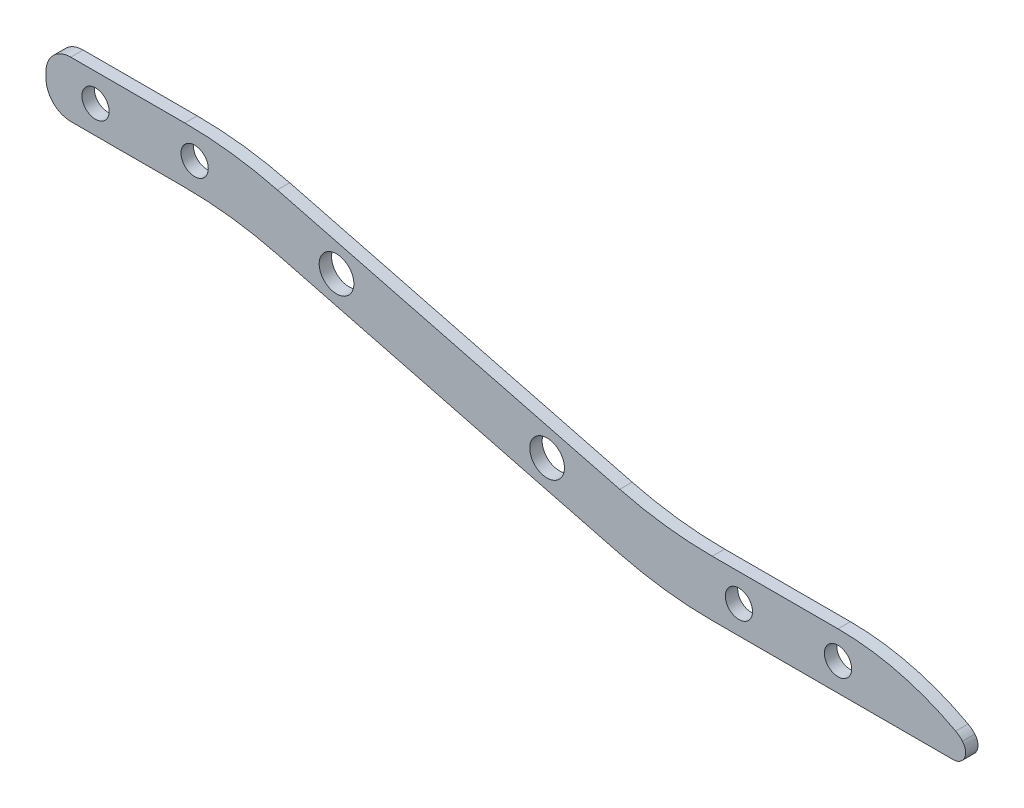
ISO-10303-21;
HEADER;
FILE_DESCRIPTION(('STEP AP214'),'2;1');
FILE_NAME('part.step','',(''),(''),'','','');
FILE_SCHEMA(('AUTOMOTIVE_DESIGN { 1 0 10303 214 1 1 1 1 }'));
ENDSEC;
DATA;
#1=APPLICATION_CONTEXT('core data for automotive mechanical design processes');
#2=APPLICATION_PROTOCOL_DEFINITION('international standard','automotive_design',2000,#1);
#3=PRODUCT_CONTEXT('',#1,'mechanical');
#4=PRODUCT('Part','Part','',(#3));
#5=PRODUCT_RELATED_PRODUCT_CATEGORY('part','',(#4));
#6=PRODUCT_DEFINITION_FORMATION('','',#4);
#7=PRODUCT_DEFINITION_CONTEXT('part definition',#1,'design');
#8=PRODUCT_DEFINITION('design','',#6,#7);
#9=PRODUCT_DEFINITION_SHAPE('','',#8);
#10=(LENGTH_UNIT() NAMED_UNIT(*) SI_UNIT(.MILLI.,.METRE.));
#11=(NAMED_UNIT(*) PLANE_ANGLE_UNIT() SI_UNIT($,.RADIAN.));
#12=(NAMED_UNIT(*) SI_UNIT($,.STERADIAN.) SOLID_ANGLE_UNIT());
#13=UNCERTAINTY_MEASURE_WITH_UNIT(LENGTH_MEASURE(1.E-05),#10,'distance_accuracy_value','');
#14=(GEOMETRIC_REPRESENTATION_CONTEXT(3) GLOBAL_UNCERTAINTY_ASSIGNED_CONTEXT((#13)) GLOBAL_UNIT_ASSIGNED_CONTEXT((#10,
#11,#12)) REPRESENTATION_CONTEXT('',''));
#15=CARTESIAN_POINT('',(0.,0.,0.));
#16=DIRECTION('',(0.,0.,1.));
#17=DIRECTION('',(1.,0.,0.));
#18=AXIS2_PLACEMENT_3D('',#15,#16,#17);
#19=CARTESIAN_POINT('',(16.6716723939733,27.75,1.));
#20=DIRECTION('',(0.,0.,1.));
#21=DIRECTION('',(1.,0.,0.));
#22=AXIS2_PLACEMENT_3D('',#19,#20,#21);
#23=PLANE('',#22);
#24=CARTESIAN_POINT('',(-13.6677647995653,2.32420737373456,1.));
#25=DIRECTION('',(0.,0.,1.));
#26=DIRECTION('',(1.,0.,0.));
#27=AXIS2_PLACEMENT_3D('',#24,#25,#26);
#28=CIRCLE('',#27,1.4);
#29=CARTESIAN_POINT('',(-12.2677647995653,2.32420737373456,1.));
#30=VERTEX_POINT('',#29);
#31=EDGE_CURVE('E355',#30,#30,#28,.T.);
#32=ORIENTED_EDGE('',*,*,#31,.F.);
#33=EDGE_LOOP('',(#32));
#34=FACE_BOUND('',#33,.T.);
#35=CARTESIAN_POINT('',(3.33223520043473,-2.04998442264176,1.));
#36=DIRECTION('',(0.,0.,1.));
#37=DIRECTION('',(1.,0.,0.));
#38=AXIS2_PLACEMENT_3D('',#35,#36,#37);
#39=CIRCLE('',#38,1.4);
#40=CARTESIAN_POINT('',(4.73223520043473,-2.04998442264176,1.));
#41=VERTEX_POINT('',#40);
#42=EDGE_CURVE('E361',#41,#41,#39,.T.);
#43=ORIENTED_EDGE('',*,*,#42,.F.);
#44=EDGE_LOOP('',(#43));
#45=FACE_BOUND('',#44,.T.);
#46=CARTESIAN_POINT('',(-25.1237342699777,4.5,1.));
#47=DIRECTION('',(0.,0.,1.));
#48=DIRECTION('',(1.,0.,0.));
#49=AXIS2_PLACEMENT_3D('',#46,#47,#48);
#50=CIRCLE('',#49,1.10000000000001);
#51=CARTESIAN_POINT('',(-24.0237342699777,4.5,1.));
#52=VERTEX_POINT('',#51);
#53=EDGE_CURVE('E372',#52,#52,#50,.T.);
#54=ORIENTED_EDGE('',*,*,#53,.F.);
#55=EDGE_LOOP('',(#54));
#56=FACE_BOUND('',#55,.T.);
#57=CARTESIAN_POINT('',(26.8214711577052,-4.5,1.));
#58=DIRECTION('',(0.,0.,1.));
#59=DIRECTION('',(1.,0.,0.));
#60=AXIS2_PLACEMENT_3D('',#57,#58,#59);
#61=CIRCLE('',#60,1.09999999999999);
#62=CARTESIAN_POINT('',(27.9214711577052,-4.5,1.));
#63=VERTEX_POINT('',#62);
#64=EDGE_CURVE('E192',#63,#63,#61,.T.);
#65=ORIENTED_EDGE('',*,*,#64,.F.);
#66=EDGE_LOOP('',(#65));
#67=FACE_BOUND('',#66,.T.);
#68=CARTESIAN_POINT('',(16.6716723939733,27.75,1.));
#69=DIRECTION('',(0.,0.,-1.));
#70=DIRECTION('',(1.,0.,0.));
#71=AXIS2_PLACEMENT_3D('',#68,#69,#70);
#72=CIRCLE('',#71,30.);
#73=CARTESIAN_POINT('',(16.6716723939733,-2.25,1.));
#74=VERTEX_POINT('',#73);
#75=CARTESIAN_POINT('',(9.20044119965471,-1.30478797790549,1.));
#76=VERTEX_POINT('',#75);
#77=EDGE_CURVE('E219',#74,#76,#72,.T.);
#78=ORIENTED_EDGE('',*,*,#77,.T.);
#79=DIRECTION('',(-0.96849293259685,0.249041039810619,0.));
#80=VECTOR('',#79,1.);
#81=CARTESIAN_POINT('',(9.20044119965471,-1.30478797790549,1.));
#82=LINE('',#81,#80);
#83=CARTESIAN_POINT('',(-18.4479097396102,5.80478797790549,1.));
#84=VERTEX_POINT('',#83);
#85=EDGE_CURVE('E127',#76,#84,#82,.T.);
#86=ORIENTED_EDGE('',*,*,#85,.T.);
#87=CARTESIAN_POINT('',(-25.9191409339287,-23.25,1.));
#88=DIRECTION('',(0.,0.,1.));
#89=DIRECTION('',(1.,0.,0.));
#90=AXIS2_PLACEMENT_3D('',#87,#88,#89);
#91=CIRCLE('',#90,30.);
#92=CARTESIAN_POINT('',(-25.9191409339287,6.75,1.));
#93=VERTEX_POINT('',#92);
#94=EDGE_CURVE('E258',#84,#93,#91,.T.);
#95=ORIENTED_EDGE('',*,*,#94,.T.);
#96=DIRECTION('',(-1.,0.,0.));
#97=VECTOR('',#96,1.);
#98=CARTESIAN_POINT('',(-25.9191409339287,6.75,1.));
#99=LINE('',#98,#97);
#100=CARTESIAN_POINT('',(-35.1237342699777,6.75,1.));
#101=VERTEX_POINT('',#100);
#102=EDGE_CURVE('E277',#93,#101,#99,.T.);
#103=ORIENTED_EDGE('',*,*,#102,.T.);
#104=CARTESIAN_POINT('',(-35.1237342699777,4.75,1.));
#105=DIRECTION('',(0.,0.,1.));
#106=DIRECTION('',(1.,0.,0.));
#107=AXIS2_PLACEMENT_3D('',#104,#105,#106);
#108=CIRCLE('',#107,2.);
#109=CARTESIAN_POINT('',(-37.1237342699777,4.75,1.));
#110=VERTEX_POINT('',#109);
#111=EDGE_CURVE('E274',#101,#110,#108,.T.);
#112=ORIENTED_EDGE('',*,*,#111,.T.);
#113=DIRECTION('',(0.,-1.,0.));
#114=VECTOR('',#113,1.);
#115=CARTESIAN_POINT('',(-37.1237342699777,4.75,1.));
#116=LINE('',#115,#114);
#117=CARTESIAN_POINT('',(-37.1237342699777,4.25,1.));
#118=VERTEX_POINT('',#117);
#119=EDGE_CURVE('E276',#110,#118,#116,.T.);
#120=ORIENTED_EDGE('',*,*,#119,.T.);
#121=CARTESIAN_POINT('',(-35.1237342699777,4.25,1.));
#122=DIRECTION('',(0.,0.,1.));
#123=DIRECTION('',(1.,0.,0.));
#124=AXIS2_PLACEMENT_3D('',#121,#122,#123);
#125=CIRCLE('',#124,2.);
#126=CARTESIAN_POINT('',(-35.1237342699777,2.25,1.));
#127=VERTEX_POINT('',#126);
#128=EDGE_CURVE('E279',#118,#127,#125,.T.);
#129=ORIENTED_EDGE('',*,*,#128,.T.);
#130=DIRECTION('',(1.,0.,0.));
#131=VECTOR('',#130,1.);
#132=CARTESIAN_POINT('',(-35.1237342699777,2.25,1.));
#133=LINE('',#132,#131);
#134=CARTESIAN_POINT('',(-25.9239870596135,2.25,1.));
#135=VERTEX_POINT('',#134);
#136=EDGE_CURVE('E285',#127,#135,#133,.T.);
#137=ORIENTED_EDGE('',*,*,#136,.T.);
#138=CARTESIAN_POINT('',(-25.9239870596135,-27.75,1.));
#139=DIRECTION('',(0.,0.,-1.));
#140=DIRECTION('',(1.,0.,0.));
#141=AXIS2_PLACEMENT_3D('',#138,#139,#140);
#142=CIRCLE('',#141,30.);
#143=CARTESIAN_POINT('',(-18.4435174286055,1.3024108138992,1.));
#144=VERTEX_POINT('',#143);
#145=EDGE_CURVE('E287',#135,#144,#142,.T.);
#146=ORIENTED_EDGE('',*,*,#145,.T.);
#147=DIRECTION('',(0.96841369379664,-0.249348987700268,0.));
#148=VECTOR('',#147,1.);
#149=CARTESIAN_POINT('',(-18.4435174286055,1.3024108138992,1.));
#150=LINE('',#149,#148);
#151=CARTESIAN_POINT('',(9.14996357887762,-5.80241081389918,1.));
#152=VERTEX_POINT('',#151);
#153=EDGE_CURVE('E289',#144,#152,#150,.T.);
#154=ORIENTED_EDGE('',*,*,#153,.T.);
#155=CARTESIAN_POINT('',(16.6304332098857,23.25,1.));
#156=DIRECTION('',(0.,0.,1.));
#157=DIRECTION('',(1.,0.,0.));
#158=AXIS2_PLACEMENT_3D('',#155,#156,#157);
#159=CIRCLE('',#158,30.);
#160=CARTESIAN_POINT('',(16.6304332098857,-6.74999999999999,1.));
#161=VERTEX_POINT('',#160);
#162=EDGE_CURVE('E291',#152,#161,#159,.T.);
#163=ORIENTED_EDGE('',*,*,#162,.T.);
#164=DIRECTION('',(1.,0.,0.));
#165=VECTOR('',#164,1.);
#166=CARTESIAN_POINT('',(16.6304332098857,-6.75,1.));
#167=LINE('',#166,#165);
#168=CARTESIAN_POINT('',(36.1237342699777,-6.75,1.));
#169=VERTEX_POINT('',#168);
#170=EDGE_CURVE('E293',#161,#169,#167,.T.);
#171=ORIENTED_EDGE('',*,*,#170,.T.);
#172=CARTESIAN_POINT('',(36.1237342699777,-5.75,1.));
#173=DIRECTION('',(0.,0.,1.));
#174=DIRECTION('',(1.,0.,0.));
#175=AXIS2_PLACEMENT_3D('',#172,#173,#174);
#176=CIRCLE('',#175,1.);
#177=CARTESIAN_POINT('',(36.8736674961734,-5.08848646555966,1.));
#178=VERTEX_POINT('',#177);
#179=EDGE_CURVE('E170',#169,#178,#176,.T.);
#180=ORIENTED_EDGE('',*,*,#179,.T.);
#181=CARTESIAN_POINT('',(35.373801043782,-6.41151353444033,1.));
#182=DIRECTION('',(0.,0.,1.));
#183=DIRECTION('',(1.,0.,0.));
#184=AXIS2_PLACEMENT_3D('',#181,#182,#183);
#185=CIRCLE('',#184,2.);
#186=CARTESIAN_POINT('',(36.3240599200128,-4.6516817049337,1.));
#187=VERTEX_POINT('',#186);
#188=EDGE_CURVE('E164',#178,#187,#185,.T.);
#189=ORIENTED_EDGE('',*,*,#188,.T.);
#190=CARTESIAN_POINT('',(26.8214711577052,-22.25,1.));
#191=DIRECTION('',(0.,0.,1.));
#192=DIRECTION('',(1.,0.,0.));
#193=AXIS2_PLACEMENT_3D('',#190,#191,#192);
#194=CIRCLE('',#193,20.);
#195=CARTESIAN_POINT('',(26.8214711577052,-2.25,1.));
#196=VERTEX_POINT('',#195);
#197=EDGE_CURVE('E168',#187,#196,#194,.T.);
#198=ORIENTED_EDGE('',*,*,#197,.T.);
#199=DIRECTION('',(-1.,0.,0.));
#200=VECTOR('',#199,1.);
#201=CARTESIAN_POINT('',(26.8214711577052,-2.25,1.));
#202=LINE('',#201,#200);
#203=EDGE_CURVE('E60',#196,#74,#202,.T.);
#204=ORIENTED_EDGE('',*,*,#203,.T.);
#205=EDGE_LOOP('',(#78,#86,#95,#103,#112,#120,#129,#137,#146,#154,#163,#171,#180,#189,#198,#204));
#206=FACE_BOUND('',#205,.T.);
#207=CARTESIAN_POINT('',(18.8214711577052,-4.5,1.));
#208=DIRECTION('',(0.,0.,1.));
#209=DIRECTION('',(1.,0.,0.));
#210=AXIS2_PLACEMENT_3D('',#207,#208,#209);
#211=CIRCLE('',#210,1.09999999999999);
#212=CARTESIAN_POINT('',(19.9214711577052,-4.5,1.));
#213=VERTEX_POINT('',#212);
#214=EDGE_CURVE('E378',#213,#213,#211,.T.);
#215=ORIENTED_EDGE('',*,*,#214,.F.);
#216=EDGE_LOOP('',(#215));
#217=FACE_BOUND('',#216,.T.);
#218=CARTESIAN_POINT('',(-33.1251422759518,4.5,1.));
#219=DIRECTION('',(0.,0.,1.));
#220=DIRECTION('',(1.,0.,0.));
#221=AXIS2_PLACEMENT_3D('',#218,#219,#220);
#222=CIRCLE('',#221,1.10000000000001);
#223=CARTESIAN_POINT('',(-32.0251422759518,4.5,1.));
#224=VERTEX_POINT('',#223);
#225=EDGE_CURVE('E366',#224,#224,#222,.T.);
#226=ORIENTED_EDGE('',*,*,#225,.F.);
#227=EDGE_LOOP('',(#226));
#228=FACE_BOUND('',#227,.T.);
#229=ADVANCED_FACE('F43',(#34,#45,#56,#67,#206,#217,#228),#23,.T.);
#230=CARTESIAN_POINT('',(16.6716723939733,27.75,0.));
#231=DIRECTION('',(0.,0.,1.));
#232=DIRECTION('',(1.,0.,0.));
#233=AXIS2_PLACEMENT_3D('',#230,#231,#232);
#234=PLANE('',#233);
#235=CARTESIAN_POINT('',(-13.6677647995653,2.32420737373456,0.));
#236=DIRECTION('',(0.,0.,1.));
#237=DIRECTION('',(1.,0.,0.));
#238=AXIS2_PLACEMENT_3D('',#235,#236,#237);
#239=CIRCLE('',#238,1.4);
#240=CARTESIAN_POINT('',(-12.2677647995653,2.32420737373456,0.));
#241=VERTEX_POINT('',#240);
#242=EDGE_CURVE('E353',#241,#241,#239,.T.);
#243=ORIENTED_EDGE('',*,*,#242,.T.);
#244=EDGE_LOOP('',(#243));
#245=FACE_BOUND('',#244,.T.);
#246=CARTESIAN_POINT('',(3.33223520043473,-2.04998442264176,0.));
#247=DIRECTION('',(0.,0.,1.));
#248=DIRECTION('',(1.,0.,0.));
#249=AXIS2_PLACEMENT_3D('',#246,#247,#248);
#250=CIRCLE('',#249,1.4);
#251=CARTESIAN_POINT('',(4.73223520043473,-2.04998442264176,0.));
#252=VERTEX_POINT('',#251);
#253=EDGE_CURVE('E356',#252,#252,#250,.T.);
#254=ORIENTED_EDGE('',*,*,#253,.T.);
#255=EDGE_LOOP('',(#254));
#256=FACE_BOUND('',#255,.T.);
#257=CARTESIAN_POINT('',(16.6716723939733,27.75,0.));
#258=DIRECTION('',(0.,0.,-1.));
#259=DIRECTION('',(1.,0.,0.));
#260=AXIS2_PLACEMENT_3D('',#257,#258,#259);
#261=CIRCLE('',#260,30.);
#262=CARTESIAN_POINT('',(16.6716723939733,-2.25,0.));
#263=VERTEX_POINT('',#262);
#264=CARTESIAN_POINT('',(9.20044119965471,-1.30478797790549,0.));
#265=VERTEX_POINT('',#264);
#266=EDGE_CURVE('E188',#263,#265,#261,.T.);
#267=ORIENTED_EDGE('',*,*,#266,.F.);
#268=DIRECTION('',(-1.,0.,0.));
#269=VECTOR('',#268,1.);
#270=CARTESIAN_POINT('',(26.8214711577052,-2.25,0.));
#271=LINE('',#270,#269);
#272=CARTESIAN_POINT('',(26.8214711577052,-2.25,0.));
#273=VERTEX_POINT('',#272);
#274=EDGE_CURVE('E119',#273,#263,#271,.T.);
#275=ORIENTED_EDGE('',*,*,#274,.F.);
#276=CARTESIAN_POINT('',(26.8214711577052,-22.25,0.));
#277=DIRECTION('',(0.,0.,1.));
#278=DIRECTION('',(1.,0.,0.));
#279=AXIS2_PLACEMENT_3D('',#276,#277,#278);
#280=CIRCLE('',#279,20.);
#281=CARTESIAN_POINT('',(36.3240599200128,-4.6516817049337,0.));
#282=VERTEX_POINT('',#281);
#283=EDGE_CURVE('E113',#282,#273,#280,.T.);
#284=ORIENTED_EDGE('',*,*,#283,.F.);
#285=CARTESIAN_POINT('',(35.373801043782,-6.41151353444033,0.));
#286=DIRECTION('',(0.,0.,1.));
#287=DIRECTION('',(1.,0.,0.));
#288=AXIS2_PLACEMENT_3D('',#285,#286,#287);
#289=CIRCLE('',#288,2.);
#290=CARTESIAN_POINT('',(36.8736674961734,-5.08848646555966,0.));
#291=VERTEX_POINT('',#290);
#292=EDGE_CURVE('E178',#291,#282,#289,.T.);
#293=ORIENTED_EDGE('',*,*,#292,.F.);
#294=CARTESIAN_POINT('',(36.1237342699777,-5.75,0.));
#295=DIRECTION('',(0.,0.,1.));
#296=DIRECTION('',(1.,0.,0.));
#297=AXIS2_PLACEMENT_3D('',#294,#295,#296);
#298=CIRCLE('',#297,1.);
#299=CARTESIAN_POINT('',(36.1237342699777,-6.75,0.));
#300=VERTEX_POINT('',#299);
#301=EDGE_CURVE('E214',#300,#291,#298,.T.);
#302=ORIENTED_EDGE('',*,*,#301,.F.);
#303=DIRECTION('',(1.,0.,0.));
#304=VECTOR('',#303,1.);
#305=CARTESIAN_POINT('',(16.6304332098857,-6.75,0.));
#306=LINE('',#305,#304);
#307=CARTESIAN_POINT('',(16.6304332098857,-6.74999999999999,0.));
#308=VERTEX_POINT('',#307);
#309=EDGE_CURVE('E212',#308,#300,#306,.T.);
#310=ORIENTED_EDGE('',*,*,#309,.F.);
#311=CARTESIAN_POINT('',(16.6304332098857,23.25,0.));
#312=DIRECTION('',(0.,0.,1.));
#313=DIRECTION('',(1.,0.,0.));
#314=AXIS2_PLACEMENT_3D('',#311,#312,#313);
#315=CIRCLE('',#314,30.);
#316=CARTESIAN_POINT('',(9.14996357887762,-5.80241081389918,0.));
#317=VERTEX_POINT('',#316);
#318=EDGE_CURVE('E210',#317,#308,#315,.T.);
#319=ORIENTED_EDGE('',*,*,#318,.F.);
#320=DIRECTION('',(0.96841369379664,-0.249348987700268,0.));
#321=VECTOR('',#320,1.);
#322=CARTESIAN_POINT('',(-18.4435174286055,1.3024108138992,0.));
#323=LINE('',#322,#321);
#324=CARTESIAN_POINT('',(-18.4435174286055,1.3024108138992,0.));
#325=VERTEX_POINT('',#324);
#326=EDGE_CURVE('E208',#325,#317,#323,.T.);
#327=ORIENTED_EDGE('',*,*,#326,.F.);
#328=CARTESIAN_POINT('',(-25.9239870596135,-27.75,0.));
#329=DIRECTION('',(0.,0.,-1.));
#330=DIRECTION('',(1.,0.,0.));
#331=AXIS2_PLACEMENT_3D('',#328,#329,#330);
#332=CIRCLE('',#331,30.);
#333=CARTESIAN_POINT('',(-25.9239870596135,2.25,0.));
#334=VERTEX_POINT('',#333);
#335=EDGE_CURVE('E206',#334,#325,#332,.T.);
#336=ORIENTED_EDGE('',*,*,#335,.F.);
#337=DIRECTION('',(1.,0.,0.));
#338=VECTOR('',#337,1.);
#339=CARTESIAN_POINT('',(-35.1237342699777,2.25,0.));
#340=LINE('',#339,#338);
#341=CARTESIAN_POINT('',(-35.1237342699777,2.25,0.));
#342=VERTEX_POINT('',#341);
#343=EDGE_CURVE('E204',#342,#334,#340,.T.);
#344=ORIENTED_EDGE('',*,*,#343,.F.);
#345=CARTESIAN_POINT('',(-35.1237342699777,4.25,0.));
#346=DIRECTION('',(0.,0.,1.));
#347=DIRECTION('',(1.,0.,0.));
#348=AXIS2_PLACEMENT_3D('',#345,#346,#347);
#349=CIRCLE('',#348,2.);
#350=CARTESIAN_POINT('',(-37.1237342699777,4.25,0.));
#351=VERTEX_POINT('',#350);
#352=EDGE_CURVE('E202',#351,#342,#349,.T.);
#353=ORIENTED_EDGE('',*,*,#352,.F.);
#354=DIRECTION('',(0.,-1.,0.));
#355=VECTOR('',#354,1.);
#356=CARTESIAN_POINT('',(-37.1237342699777,4.75,0.));
#357=LINE('',#356,#355);
#358=CARTESIAN_POINT('',(-37.1237342699777,4.75,0.));
#359=VERTEX_POINT('',#358);
#360=EDGE_CURVE('E200',#359,#351,#357,.T.);
#361=ORIENTED_EDGE('',*,*,#360,.F.);
#362=CARTESIAN_POINT('',(-35.1237342699777,4.75,0.));
#363=DIRECTION('',(0.,0.,1.));
#364=DIRECTION('',(1.,0.,0.));
#365=AXIS2_PLACEMENT_3D('',#362,#363,#364);
#366=CIRCLE('',#365,2.);
#367=CARTESIAN_POINT('',(-35.1237342699777,6.75,0.));
#368=VERTEX_POINT('',#367);
#369=EDGE_CURVE('E198',#368,#359,#366,.T.);
#370=ORIENTED_EDGE('',*,*,#369,.F.);
#371=DIRECTION('',(-1.,0.,0.));
#372=VECTOR('',#371,1.);
#373=CARTESIAN_POINT('',(-25.9191409339287,6.75,0.));
#374=LINE('',#373,#372);
#375=CARTESIAN_POINT('',(-25.9191409339287,6.75,0.));
#376=VERTEX_POINT('',#375);
#377=EDGE_CURVE('E196',#376,#368,#374,.T.);
#378=ORIENTED_EDGE('',*,*,#377,.F.);
#379=CARTESIAN_POINT('',(-25.9191409339287,-23.25,0.));
#380=DIRECTION('',(0.,0.,1.));
#381=DIRECTION('',(1.,0.,0.));
#382=AXIS2_PLACEMENT_3D('',#379,#380,#381);
#383=CIRCLE('',#382,30.);
#384=CARTESIAN_POINT('',(-18.4479097396102,5.80478797790549,0.));
#385=VERTEX_POINT('',#384);
#386=EDGE_CURVE('E194',#385,#376,#383,.T.);
#387=ORIENTED_EDGE('',*,*,#386,.F.);
#388=DIRECTION('',(-0.96849293259685,0.249041039810619,0.));
#389=VECTOR('',#388,1.);
#390=CARTESIAN_POINT('',(9.20044119965471,-1.30478797790549,0.));
#391=LINE('',#390,#389);
#392=EDGE_CURVE('E191',#265,#385,#391,.T.);
#393=ORIENTED_EDGE('',*,*,#392,.F.);
#394=EDGE_LOOP('',(#267,#275,#284,#293,#302,#310,#319,#327,#336,#344,#353,#361,#370,#378,#387,#393));
#395=FACE_BOUND('',#394,.T.);
#396=CARTESIAN_POINT('',(26.8214711577052,-4.5,0.));
#397=DIRECTION('',(0.,0.,1.));
#398=DIRECTION('',(1.,0.,0.));
#399=AXIS2_PLACEMENT_3D('',#396,#397,#398);
#400=CIRCLE('',#399,1.09999999999999);
#401=CARTESIAN_POINT('',(27.9214711577052,-4.5,0.));
#402=VERTEX_POINT('',#401);
#403=EDGE_CURVE('E381',#402,#402,#400,.T.);
#404=ORIENTED_EDGE('',*,*,#403,.T.);
#405=EDGE_LOOP('',(#404));
#406=FACE_BOUND('',#405,.T.);
#407=CARTESIAN_POINT('',(18.8214711577052,-4.5,0.));
#408=DIRECTION('',(0.,0.,1.));
#409=DIRECTION('',(1.,0.,0.));
#410=AXIS2_PLACEMENT_3D('',#407,#408,#409);
#411=CIRCLE('',#410,1.09999999999999);
#412=CARTESIAN_POINT('',(19.9214711577052,-4.5,0.));
#413=VERTEX_POINT('',#412);
#414=EDGE_CURVE('E375',#413,#413,#411,.T.);
#415=ORIENTED_EDGE('',*,*,#414,.T.);
#416=EDGE_LOOP('',(#415));
#417=FACE_BOUND('',#416,.T.);
#418=CARTESIAN_POINT('',(-25.1237342699777,4.5,0.));
#419=DIRECTION('',(0.,0.,1.));
#420=DIRECTION('',(1.,0.,0.));
#421=AXIS2_PLACEMENT_3D('',#418,#419,#420);
#422=CIRCLE('',#421,1.10000000000001);
#423=CARTESIAN_POINT('',(-24.0237342699777,4.5,0.));
#424=VERTEX_POINT('',#423);
#425=EDGE_CURVE('E369',#424,#424,#422,.T.);
#426=ORIENTED_EDGE('',*,*,#425,.T.);
#427=EDGE_LOOP('',(#426));
#428=FACE_BOUND('',#427,.T.);
#429=CARTESIAN_POINT('',(-33.1251422759518,4.5,0.));
#430=DIRECTION('',(0.,0.,1.));
#431=DIRECTION('',(1.,0.,0.));
#432=AXIS2_PLACEMENT_3D('',#429,#430,#431);
#433=CIRCLE('',#432,1.10000000000001);
#434=CARTESIAN_POINT('',(-32.0251422759518,4.5,0.));
#435=VERTEX_POINT('',#434);
#436=EDGE_CURVE('E358',#435,#435,#433,.T.);
#437=ORIENTED_EDGE('',*,*,#436,.T.);
#438=EDGE_LOOP('',(#437));
#439=FACE_BOUND('',#438,.T.);
#440=ADVANCED_FACE('F262',(#245,#256,#395,#406,#417,#428,#439),#234,.F.);
#441=CARTESIAN_POINT('',(16.6716723939733,27.75,1.));
#442=DIRECTION('',(0.,0.,-1.));
#443=DIRECTION('',(-1.,0.,0.));
#444=AXIS2_PLACEMENT_3D('',#441,#442,#443);
#445=CYLINDRICAL_SURFACE('',#444,30.);
#446=ORIENTED_EDGE('',*,*,#266,.T.);
#447=DIRECTION('',(0.,0.,-1.));
#448=VECTOR('',#447,1.);
#449=CARTESIAN_POINT('',(9.20044119965471,-1.30478797790549,1.));
#450=LINE('',#449,#448);
#451=EDGE_CURVE('E11',#76,#265,#450,.T.);
#452=ORIENTED_EDGE('',*,*,#451,.F.);
#453=ORIENTED_EDGE('',*,*,#77,.F.);
#454=DIRECTION('',(0.,0.,-1.));
#455=VECTOR('',#454,1.);
#456=CARTESIAN_POINT('',(16.6716723939733,-2.25,1.));
#457=LINE('',#456,#455);
#458=EDGE_CURVE('E184',#74,#263,#457,.T.);
#459=ORIENTED_EDGE('',*,*,#458,.T.);
#460=EDGE_LOOP('',(#446,#452,#453,#459));
#461=FACE_BOUND('',#460,.T.);
#462=ADVANCED_FACE('F45',(#461),#445,.F.);
#463=CARTESIAN_POINT('',(9.20044119965471,-1.30478797790549,1.));
#464=DIRECTION('',(-0.249041039810619,-0.96849293259685,0.));
#465=DIRECTION('',(0.96849293259685,-0.249041039810619,0.));
#466=AXIS2_PLACEMENT_3D('',#463,#464,#465);
#467=PLANE('',#466);
#468=ORIENTED_EDGE('',*,*,#392,.T.);
#469=DIRECTION('',(0.,0.,-1.));
#470=VECTOR('',#469,1.);
#471=CARTESIAN_POINT('',(-18.4479097396102,5.80478797790549,1.));
#472=LINE('',#471,#470);
#473=EDGE_CURVE('E52',#84,#385,#472,.T.);
#474=ORIENTED_EDGE('',*,*,#473,.F.);
#475=ORIENTED_EDGE('',*,*,#85,.F.);
#476=ORIENTED_EDGE('',*,*,#451,.T.);
#477=EDGE_LOOP('',(#468,#474,#475,#476));
#478=FACE_BOUND('',#477,.T.);
#479=ADVANCED_FACE('F435',(#478),#467,.F.);
#480=CARTESIAN_POINT('',(-25.9191409339287,-23.25,1.));
#481=DIRECTION('',(0.,0.,-1.));
#482=DIRECTION('',(-1.,0.,0.));
#483=AXIS2_PLACEMENT_3D('',#480,#481,#482);
#484=CYLINDRICAL_SURFACE('',#483,30.);
#485=ORIENTED_EDGE('',*,*,#386,.T.);
#486=DIRECTION('',(0.,0.,-1.));
#487=VECTOR('',#486,1.);
#488=CARTESIAN_POINT('',(-25.9191409339287,6.75,1.));
#489=LINE('',#488,#487);
#490=EDGE_CURVE('E250',#93,#376,#489,.T.);
#491=ORIENTED_EDGE('',*,*,#490,.F.);
#492=ORIENTED_EDGE('',*,*,#94,.F.);
#493=ORIENTED_EDGE('',*,*,#473,.T.);
#494=EDGE_LOOP('',(#485,#491,#492,#493));
#495=FACE_BOUND('',#494,.T.);
#496=ADVANCED_FACE('F256',(#495),#484,.T.);
#497=CARTESIAN_POINT('',(-25.9191409339287,6.75,1.));
#498=DIRECTION('',(0.,-1.,0.));
#499=DIRECTION('',(0.,0.,-1.));
#500=AXIS2_PLACEMENT_3D('',#497,#498,#499);
#501=PLANE('',#500);
#502=ORIENTED_EDGE('',*,*,#377,.T.);
#503=DIRECTION('',(0.,0.,-1.));
#504=VECTOR('',#503,1.);
#505=CARTESIAN_POINT('',(-35.1237342699777,6.75,1.));
#506=LINE('',#505,#504);
#507=EDGE_CURVE('E247',#101,#368,#506,.T.);
#508=ORIENTED_EDGE('',*,*,#507,.F.);
#509=ORIENTED_EDGE('',*,*,#102,.F.);
#510=ORIENTED_EDGE('',*,*,#490,.T.);
#511=EDGE_LOOP('',(#502,#508,#509,#510));
#512=FACE_BOUND('',#511,.T.);
#513=ADVANCED_FACE('F268',(#512),#501,.F.);
#514=CARTESIAN_POINT('',(-35.1237342699777,4.75,1.));
#515=DIRECTION('',(0.,0.,-1.));
#516=DIRECTION('',(-1.,0.,0.));
#517=AXIS2_PLACEMENT_3D('',#514,#515,#516);
#518=CYLINDRICAL_SURFACE('',#517,2.);
#519=ORIENTED_EDGE('',*,*,#369,.T.);
#520=DIRECTION('',(0.,0.,-1.));
#521=VECTOR('',#520,1.);
#522=CARTESIAN_POINT('',(-37.1237342699777,4.75,1.));
#523=LINE('',#522,#521);
#524=EDGE_CURVE('E244',#110,#359,#523,.T.);
#525=ORIENTED_EDGE('',*,*,#524,.F.);
#526=ORIENTED_EDGE('',*,*,#111,.F.);
#527=ORIENTED_EDGE('',*,*,#507,.T.);
#528=EDGE_LOOP('',(#519,#525,#526,#527));
#529=FACE_BOUND('',#528,.T.);
#530=ADVANCED_FACE('F272',(#529),#518,.T.);
#531=CARTESIAN_POINT('',(-37.1237342699777,4.75,1.));
#532=DIRECTION('',(1.,0.,0.));
#533=DIRECTION('',(0.,0.,-1.));
#534=AXIS2_PLACEMENT_3D('',#531,#532,#533);
#535=PLANE('',#534);
#536=ORIENTED_EDGE('',*,*,#360,.T.);
#537=DIRECTION('',(0.,0.,-1.));
#538=VECTOR('',#537,1.);
#539=CARTESIAN_POINT('',(-37.1237342699777,4.25,1.));
#540=LINE('',#539,#538);
#541=EDGE_CURVE('E241',#118,#351,#540,.T.);
#542=ORIENTED_EDGE('',*,*,#541,.F.);
#543=ORIENTED_EDGE('',*,*,#119,.F.);
#544=ORIENTED_EDGE('',*,*,#524,.T.);
#545=EDGE_LOOP('',(#536,#542,#543,#544));
#546=FACE_BOUND('',#545,.T.);
#547=ADVANCED_FACE('F466',(#546),#535,.F.);
#548=CARTESIAN_POINT('',(-35.1237342699777,4.25,1.));
#549=DIRECTION('',(0.,0.,-1.));
#550=DIRECTION('',(-1.,0.,0.));
#551=AXIS2_PLACEMENT_3D('',#548,#549,#550);
#552=CYLINDRICAL_SURFACE('',#551,2.);
#553=ORIENTED_EDGE('',*,*,#352,.T.);
#554=DIRECTION('',(0.,0.,-1.));
#555=VECTOR('',#554,1.);
#556=CARTESIAN_POINT('',(-35.1237342699777,2.25,1.));
#557=LINE('',#556,#555);
#558=EDGE_CURVE('E238',#127,#342,#557,.T.);
#559=ORIENTED_EDGE('',*,*,#558,.F.);
#560=ORIENTED_EDGE('',*,*,#128,.F.);
#561=ORIENTED_EDGE('',*,*,#541,.T.);
#562=EDGE_LOOP('',(#553,#559,#560,#561));
#563=FACE_BOUND('',#562,.T.);
#564=ADVANCED_FACE('F475',(#563),#552,.T.);
#565=CARTESIAN_POINT('',(-35.1237342699777,2.25,1.));
#566=DIRECTION('',(0.,1.,0.));
#567=DIRECTION('',(0.,0.,1.));
#568=AXIS2_PLACEMENT_3D('',#565,#566,#567);
#569=PLANE('',#568);
#570=ORIENTED_EDGE('',*,*,#343,.T.);
#571=DIRECTION('',(0.,0.,-1.));
#572=VECTOR('',#571,1.);
#573=CARTESIAN_POINT('',(-25.9239870596135,2.25,1.));
#574=LINE('',#573,#572);
#575=EDGE_CURVE('E235',#135,#334,#574,.T.);
#576=ORIENTED_EDGE('',*,*,#575,.F.);
#577=ORIENTED_EDGE('',*,*,#136,.F.);
#578=ORIENTED_EDGE('',*,*,#558,.T.);
#579=EDGE_LOOP('',(#570,#576,#577,#578));
#580=FACE_BOUND('',#579,.T.);
#581=ADVANCED_FACE('F485',(#580),#569,.F.);
#582=CARTESIAN_POINT('',(-25.9239870596135,-27.75,1.));
#583=DIRECTION('',(0.,0.,-1.));
#584=DIRECTION('',(-1.,0.,0.));
#585=AXIS2_PLACEMENT_3D('',#582,#583,#584);
#586=CYLINDRICAL_SURFACE('',#585,30.);
#587=ORIENTED_EDGE('',*,*,#335,.T.);
#588=DIRECTION('',(0.,0.,-1.));
#589=VECTOR('',#588,1.);
#590=CARTESIAN_POINT('',(-18.4435174286055,1.3024108138992,1.));
#591=LINE('',#590,#589);
#592=EDGE_CURVE('E232',#144,#325,#591,.T.);
#593=ORIENTED_EDGE('',*,*,#592,.F.);
#594=ORIENTED_EDGE('',*,*,#145,.F.);
#595=ORIENTED_EDGE('',*,*,#575,.T.);
#596=EDGE_LOOP('',(#587,#593,#594,#595));
#597=FACE_BOUND('',#596,.T.);
#598=ADVANCED_FACE('F495',(#597),#586,.F.);
#599=CARTESIAN_POINT('',(-18.4435174286055,1.3024108138992,1.));
#600=DIRECTION('',(0.249348987700268,0.96841369379664,0.));
#601=DIRECTION('',(-0.96841369379664,0.249348987700268,0.));
#602=AXIS2_PLACEMENT_3D('',#599,#600,#601);
#603=PLANE('',#602);
#604=ORIENTED_EDGE('',*,*,#326,.T.);
#605=DIRECTION('',(0.,0.,-1.));
#606=VECTOR('',#605,1.);
#607=CARTESIAN_POINT('',(9.14996357887762,-5.80241081389918,1.));
#608=LINE('',#607,#606);
#609=EDGE_CURVE('E229',#152,#317,#608,.T.);
#610=ORIENTED_EDGE('',*,*,#609,.F.);
#611=ORIENTED_EDGE('',*,*,#153,.F.);
#612=ORIENTED_EDGE('',*,*,#592,.T.);
#613=EDGE_LOOP('',(#604,#610,#611,#612));
#614=FACE_BOUND('',#613,.T.);
#615=ADVANCED_FACE('F505',(#614),#603,.F.);
#616=CARTESIAN_POINT('',(16.6304332098857,23.25,1.));
#617=DIRECTION('',(0.,0.,-1.));
#618=DIRECTION('',(-1.,0.,0.));
#619=AXIS2_PLACEMENT_3D('',#616,#617,#618);
#620=CYLINDRICAL_SURFACE('',#619,30.);
#621=ORIENTED_EDGE('',*,*,#318,.T.);
#622=DIRECTION('',(0.,0.,-1.));
#623=VECTOR('',#622,1.);
#624=CARTESIAN_POINT('',(16.6304332098857,-6.74999999999999,1.));
#625=LINE('',#624,#623);
#626=EDGE_CURVE('E226',#161,#308,#625,.T.);
#627=ORIENTED_EDGE('',*,*,#626,.F.);
#628=ORIENTED_EDGE('',*,*,#162,.F.);
#629=ORIENTED_EDGE('',*,*,#609,.T.);
#630=EDGE_LOOP('',(#621,#627,#628,#629));
#631=FACE_BOUND('',#630,.T.);
#632=ADVANCED_FACE('F515',(#631),#620,.T.);
#633=CARTESIAN_POINT('',(16.6304332098857,-6.75,1.));
#634=DIRECTION('',(0.,1.,0.));
#635=DIRECTION('',(0.,0.,1.));
#636=AXIS2_PLACEMENT_3D('',#633,#634,#635);
#637=PLANE('',#636);
#638=ORIENTED_EDGE('',*,*,#309,.T.);
#639=DIRECTION('',(0.,0.,-1.));
#640=VECTOR('',#639,1.);
#641=CARTESIAN_POINT('',(36.1237342699777,-6.75,1.));
#642=LINE('',#641,#640);
#643=EDGE_CURVE('E223',#169,#300,#642,.T.);
#644=ORIENTED_EDGE('',*,*,#643,.F.);
#645=ORIENTED_EDGE('',*,*,#170,.F.);
#646=ORIENTED_EDGE('',*,*,#626,.T.);
#647=EDGE_LOOP('',(#638,#644,#645,#646));
#648=FACE_BOUND('',#647,.T.);
#649=ADVANCED_FACE('F299',(#648),#637,.F.);
#650=CARTESIAN_POINT('',(36.1237342699777,-5.75,1.));
#651=DIRECTION('',(0.,0.,-1.));
#652=DIRECTION('',(-1.,0.,0.));
#653=AXIS2_PLACEMENT_3D('',#650,#651,#652);
#654=CYLINDRICAL_SURFACE('',#653,1.);
#655=ORIENTED_EDGE('',*,*,#301,.T.);
#656=DIRECTION('',(0.,0.,-1.));
#657=VECTOR('',#656,1.);
#658=CARTESIAN_POINT('',(36.8736674961734,-5.08848646555966,1.));
#659=LINE('',#658,#657);
#660=EDGE_CURVE('E179',#178,#291,#659,.T.);
#661=ORIENTED_EDGE('',*,*,#660,.F.);
#662=ORIENTED_EDGE('',*,*,#179,.F.);
#663=ORIENTED_EDGE('',*,*,#643,.T.);
#664=EDGE_LOOP('',(#655,#661,#662,#663));
#665=FACE_BOUND('',#664,.T.);
#666=ADVANCED_FACE('F303',(#665),#654,.T.);
#667=CARTESIAN_POINT('',(35.373801043782,-6.41151353444033,1.));
#668=DIRECTION('',(0.,0.,-1.));
#669=DIRECTION('',(-1.,0.,0.));
#670=AXIS2_PLACEMENT_3D('',#667,#668,#669);
#671=CYLINDRICAL_SURFACE('',#670,2.);
#672=ORIENTED_EDGE('',*,*,#292,.T.);
#673=DIRECTION('',(0.,0.,-1.));
#674=VECTOR('',#673,1.);
#675=CARTESIAN_POINT('',(36.3240599200128,-4.6516817049337,1.));
#676=LINE('',#675,#674);
#677=EDGE_CURVE('E175',#187,#282,#676,.T.);
#678=ORIENTED_EDGE('',*,*,#677,.F.);
#679=ORIENTED_EDGE('',*,*,#188,.F.);
#680=ORIENTED_EDGE('',*,*,#660,.T.);
#681=EDGE_LOOP('',(#672,#678,#679,#680));
#682=FACE_BOUND('',#681,.T.);
#683=ADVANCED_FACE('F176',(#682),#671,.T.);
#684=CARTESIAN_POINT('',(26.8214711577052,-22.25,1.));
#685=DIRECTION('',(0.,0.,-1.));
#686=DIRECTION('',(-1.,0.,0.));
#687=AXIS2_PLACEMENT_3D('',#684,#685,#686);
#688=CYLINDRICAL_SURFACE('',#687,20.);
#689=ORIENTED_EDGE('',*,*,#283,.T.);
#690=DIRECTION('',(0.,0.,-1.));
#691=VECTOR('',#690,1.);
#692=CARTESIAN_POINT('',(26.8214711577052,-2.25,1.));
#693=LINE('',#692,#691);
#694=EDGE_CURVE('E180',#196,#273,#693,.T.);
#695=ORIENTED_EDGE('',*,*,#694,.F.);
#696=ORIENTED_EDGE('',*,*,#197,.F.);
#697=ORIENTED_EDGE('',*,*,#677,.T.);
#698=EDGE_LOOP('',(#689,#695,#696,#697));
#699=FACE_BOUND('',#698,.T.);
#700=ADVANCED_FACE('F182',(#699),#688,.T.);
#701=CARTESIAN_POINT('',(26.8214711577052,-2.25,1.));
#702=DIRECTION('',(0.,-1.,0.));
#703=DIRECTION('',(0.,0.,-1.));
#704=AXIS2_PLACEMENT_3D('',#701,#702,#703);
#705=PLANE('',#704);
#706=ORIENTED_EDGE('',*,*,#274,.T.);
#707=ORIENTED_EDGE('',*,*,#458,.F.);
#708=ORIENTED_EDGE('',*,*,#203,.F.);
#709=ORIENTED_EDGE('',*,*,#694,.T.);
#710=EDGE_LOOP('',(#706,#707,#708,#709));
#711=FACE_BOUND('',#710,.T.);
#712=ADVANCED_FACE('F307',(#711),#705,.F.);
#713=CARTESIAN_POINT('',(26.8214711577052,-4.5,1.));
#714=DIRECTION('',(0.,0.,-1.));
#715=DIRECTION('',(-1.,0.,0.));
#716=AXIS2_PLACEMENT_3D('',#713,#714,#715);
#717=CYLINDRICAL_SURFACE('',#716,1.09999999999999);
#718=ORIENTED_EDGE('',*,*,#64,.T.);
#719=EDGE_LOOP('',(#718));
#720=FACE_BOUND('',#719,.T.);
#721=ORIENTED_EDGE('',*,*,#403,.F.);
#722=EDGE_LOOP('',(#721));
#723=FACE_BOUND('',#722,.T.);
#724=ADVANCED_FACE('F309',(#720,#723),#717,.F.);
#725=CARTESIAN_POINT('',(18.8214711577052,-4.5,1.));
#726=DIRECTION('',(0.,0.,-1.));
#727=DIRECTION('',(-1.,0.,0.));
#728=AXIS2_PLACEMENT_3D('',#725,#726,#727);
#729=CYLINDRICAL_SURFACE('',#728,1.09999999999999);
#730=ORIENTED_EDGE('',*,*,#214,.T.);
#731=EDGE_LOOP('',(#730));
#732=FACE_BOUND('',#731,.T.);
#733=ORIENTED_EDGE('',*,*,#414,.F.);
#734=EDGE_LOOP('',(#733));
#735=FACE_BOUND('',#734,.T.);
#736=ADVANCED_FACE('F315',(#732,#735),#729,.F.);
#737=CARTESIAN_POINT('',(-25.1237342699777,4.5,1.));
#738=DIRECTION('',(0.,0.,-1.));
#739=DIRECTION('',(-1.,0.,0.));
#740=AXIS2_PLACEMENT_3D('',#737,#738,#739);
#741=CYLINDRICAL_SURFACE('',#740,1.10000000000001);
#742=ORIENTED_EDGE('',*,*,#53,.T.);
#743=EDGE_LOOP('',(#742));
#744=FACE_BOUND('',#743,.T.);
#745=ORIENTED_EDGE('',*,*,#425,.F.);
#746=EDGE_LOOP('',(#745));
#747=FACE_BOUND('',#746,.T.);
#748=ADVANCED_FACE('F333',(#744,#747),#741,.F.);
#749=CARTESIAN_POINT('',(-33.1251422759518,4.5,1.));
#750=DIRECTION('',(0.,0.,-1.));
#751=DIRECTION('',(-1.,0.,0.));
#752=AXIS2_PLACEMENT_3D('',#749,#750,#751);
#753=CYLINDRICAL_SURFACE('',#752,1.10000000000001);
#754=ORIENTED_EDGE('',*,*,#225,.T.);
#755=EDGE_LOOP('',(#754));
#756=FACE_BOUND('',#755,.T.);
#757=ORIENTED_EDGE('',*,*,#436,.F.);
#758=EDGE_LOOP('',(#757));
#759=FACE_BOUND('',#758,.T.);
#760=ADVANCED_FACE('F337',(#756,#759),#753,.F.);
#761=CARTESIAN_POINT('',(3.33223520043473,-2.04998442264176,0.));
#762=DIRECTION('',(0.,0.,1.));
#763=DIRECTION('',(1.,0.,0.));
#764=AXIS2_PLACEMENT_3D('',#761,#762,#763);
#765=CYLINDRICAL_SURFACE('',#764,1.4);
#766=ORIENTED_EDGE('',*,*,#253,.F.);
#767=EDGE_LOOP('',(#766));
#768=FACE_BOUND('',#767,.T.);
#769=ORIENTED_EDGE('',*,*,#42,.T.);
#770=EDGE_LOOP('',(#769));
#771=FACE_BOUND('',#770,.T.);
#772=ADVANCED_FACE('F340',(#768,#771),#765,.F.);
#773=CARTESIAN_POINT('',(-13.6677647995653,2.32420737373456,0.));
#774=DIRECTION('',(0.,0.,1.));
#775=DIRECTION('',(1.,0.,0.));
#776=AXIS2_PLACEMENT_3D('',#773,#774,#775);
#777=CYLINDRICAL_SURFACE('',#776,1.4);
#778=ORIENTED_EDGE('',*,*,#242,.F.);
#779=EDGE_LOOP('',(#778));
#780=FACE_BOUND('',#779,.T.);
#781=ORIENTED_EDGE('',*,*,#31,.T.);
#782=EDGE_LOOP('',(#781));
#783=FACE_BOUND('',#782,.T.);
#784=ADVANCED_FACE('F344',(#780,#783),#777,.F.);
#785=CLOSED_SHELL('',(#229,#440,#462,#479,#496,#513,#530,#547,#564,#581,#598,#615,#632,#649,
#666,#683,#700,#712,#724,#736,#748,#760,#772,#784));
#786=MANIFOLD_SOLID_BREP('B2',#785);
#787=ADVANCED_BREP_SHAPE_REPRESENTATION('',(#18,#786),#14);
#788=SHAPE_DEFINITION_REPRESENTATION(#9,#787);
ENDSEC;
END-ISO-10303-21;
